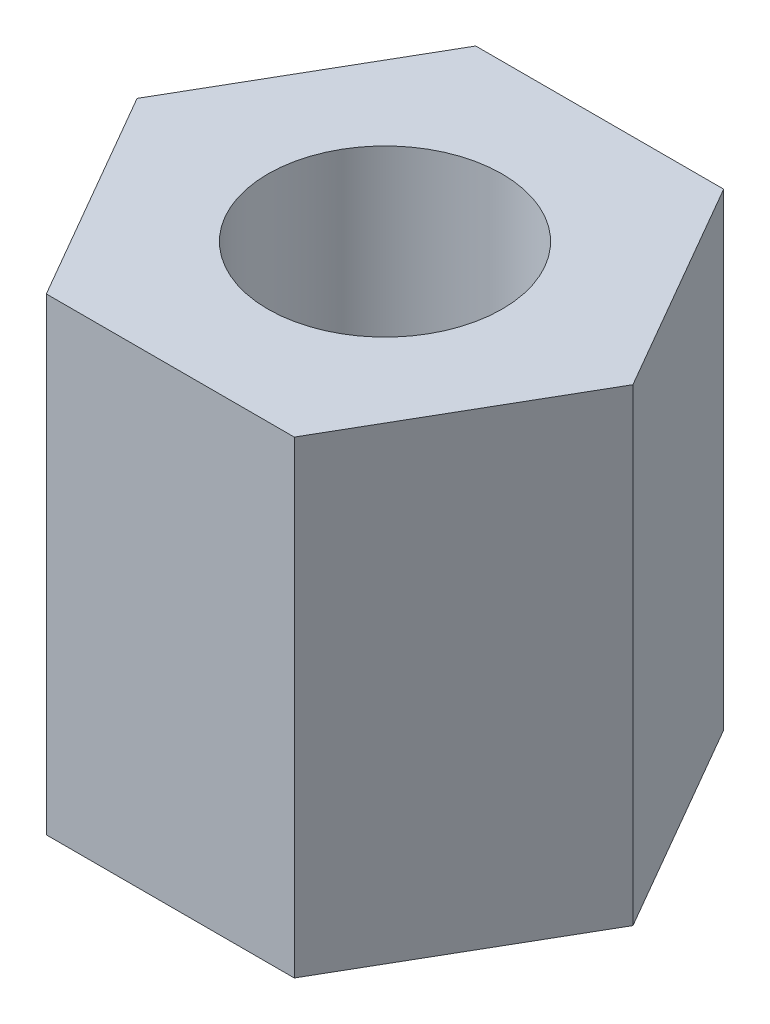
ISO-10303-21;
HEADER;
FILE_DESCRIPTION(('STEP AP214'),'2;1');
FILE_NAME('part.step','',(''),(''),'','','');
FILE_SCHEMA(('AUTOMOTIVE_DESIGN { 1 0 10303 214 1 1 1 1 }'));
ENDSEC;
DATA;
#1=APPLICATION_CONTEXT('core data for automotive mechanical design processes');
#2=APPLICATION_PROTOCOL_DEFINITION('international standard','automotive_design',2000,#1);
#3=PRODUCT_CONTEXT('',#1,'mechanical');
#4=PRODUCT('Part','Part','',(#3));
#5=PRODUCT_RELATED_PRODUCT_CATEGORY('part','',(#4));
#6=PRODUCT_DEFINITION_FORMATION('','',#4);
#7=PRODUCT_DEFINITION_CONTEXT('part definition',#1,'design');
#8=PRODUCT_DEFINITION('design','',#6,#7);
#9=PRODUCT_DEFINITION_SHAPE('','',#8);
#10=(LENGTH_UNIT() NAMED_UNIT(*) SI_UNIT(.MILLI.,.METRE.));
#11=(NAMED_UNIT(*) PLANE_ANGLE_UNIT() SI_UNIT($,.RADIAN.));
#12=(NAMED_UNIT(*) SI_UNIT($,.STERADIAN.) SOLID_ANGLE_UNIT());
#13=UNCERTAINTY_MEASURE_WITH_UNIT(LENGTH_MEASURE(1.E-05),#10,'distance_accuracy_value','');
#14=(GEOMETRIC_REPRESENTATION_CONTEXT(3) GLOBAL_UNCERTAINTY_ASSIGNED_CONTEXT((#13)) GLOBAL_UNIT_ASSIGNED_CONTEXT((#10,
#11,#12)) REPRESENTATION_CONTEXT('',''));
#15=CARTESIAN_POINT('',(0.,0.,0.));
#16=DIRECTION('',(0.,0.,1.));
#17=DIRECTION('',(1.,0.,0.));
#18=AXIS2_PLACEMENT_3D('',#15,#16,#17);
#19=CARTESIAN_POINT('',(0.,6.,0.));
#20=DIRECTION('',(0.,1.,0.));
#21=DIRECTION('',(0.,0.,1.));
#22=AXIS2_PLACEMENT_3D('',#19,#20,#21);
#23=PLANE('',#22);
#24=DIRECTION('',(0.499999999999995,0.,-0.866025403784441));
#25=VECTOR('',#24,1.);
#26=CARTESIAN_POINT('',(1.5877132402715,6.,2.74999999999998));
#27=LINE('',#26,#25);
#28=CARTESIAN_POINT('',(1.5877132402715,6.,2.74999999999998));
#29=VERTEX_POINT('',#28);
#30=CARTESIAN_POINT('',(3.17542648054294,6.,0.));
#31=VERTEX_POINT('',#30);
#32=EDGE_CURVE('E132',#29,#31,#27,.T.);
#33=ORIENTED_EDGE('',*,*,#32,.T.);
#34=DIRECTION('',(-0.500000000000001,0.,-0.866025403784438));
#35=VECTOR('',#34,1.);
#36=CARTESIAN_POINT('',(3.17542648054294,6.,0.));
#37=LINE('',#36,#35);
#38=CARTESIAN_POINT('',(1.58771324027147,6.,-2.75000000000001));
#39=VERTEX_POINT('',#38);
#40=EDGE_CURVE('E90',#31,#39,#37,.T.);
#41=ORIENTED_EDGE('',*,*,#40,.T.);
#42=DIRECTION('',(-1.,0.,0.));
#43=VECTOR('',#42,1.);
#44=CARTESIAN_POINT('',(1.58771324027147,6.,-2.75000000000001));
#45=LINE('',#44,#43);
#46=CARTESIAN_POINT('',(-1.58771324027148,6.,-2.74999999999999));
#47=VERTEX_POINT('',#46);
#48=EDGE_CURVE('E103',#39,#47,#45,.T.);
#49=ORIENTED_EDGE('',*,*,#48,.T.);
#50=DIRECTION('',(-0.499999999999995,0.,0.866025403784442));
#51=VECTOR('',#50,1.);
#52=CARTESIAN_POINT('',(-1.58771324027148,6.,-2.74999999999999));
#53=LINE('',#52,#51);
#54=CARTESIAN_POINT('',(-3.17542648054294,6.,0.));
#55=VERTEX_POINT('',#54);
#56=EDGE_CURVE('E97',#47,#55,#53,.T.);
#57=ORIENTED_EDGE('',*,*,#56,.T.);
#58=DIRECTION('',(0.500000000000007,0.,0.866025403784435));
#59=VECTOR('',#58,1.);
#60=CARTESIAN_POINT('',(-3.17542648054294,6.,0.));
#61=LINE('',#60,#59);
#62=CARTESIAN_POINT('',(-1.58771324027145,6.,2.75000000000002));
#63=VERTEX_POINT('',#62);
#64=EDGE_CURVE('E101',#55,#63,#61,.T.);
#65=ORIENTED_EDGE('',*,*,#64,.T.);
#66=DIRECTION('',(1.,0.,0.));
#67=VECTOR('',#66,1.);
#68=CARTESIAN_POINT('',(-1.58771324027145,6.,2.75000000000002));
#69=LINE('',#68,#67);
#70=EDGE_CURVE('E53',#63,#29,#69,.T.);
#71=ORIENTED_EDGE('',*,*,#70,.T.);
#72=EDGE_LOOP('',(#33,#41,#49,#57,#65,#71));
#73=FACE_BOUND('',#72,.T.);
#74=CARTESIAN_POINT('',(0.,6.,0.));
#75=DIRECTION('',(0.,1.,0.));
#76=DIRECTION('',(0.,0.,1.));
#77=AXIS2_PLACEMENT_3D('',#74,#75,#76);
#78=CIRCLE('',#77,1.5);
#79=CARTESIAN_POINT('',(0.,6.,1.5));
#80=VERTEX_POINT('',#79);
#81=EDGE_CURVE('E125',#80,#80,#78,.T.);
#82=ORIENTED_EDGE('',*,*,#81,.F.);
#83=EDGE_LOOP('',(#82));
#84=FACE_BOUND('',#83,.T.);
#85=ADVANCED_FACE('F36',(#73,#84),#23,.T.);
#86=CARTESIAN_POINT('',(0.,0.,0.));
#87=DIRECTION('',(0.,1.,0.));
#88=DIRECTION('',(0.,0.,1.));
#89=AXIS2_PLACEMENT_3D('',#86,#87,#88);
#90=PLANE('',#89);
#91=DIRECTION('',(0.499999999999995,0.,-0.866025403784441));
#92=VECTOR('',#91,1.);
#93=CARTESIAN_POINT('',(1.5877132402715,0.,2.74999999999998));
#94=LINE('',#93,#92);
#95=CARTESIAN_POINT('',(1.5877132402715,0.,2.74999999999998));
#96=VERTEX_POINT('',#95);
#97=CARTESIAN_POINT('',(3.17542648054294,0.,0.));
#98=VERTEX_POINT('',#97);
#99=EDGE_CURVE('E121',#96,#98,#94,.T.);
#100=ORIENTED_EDGE('',*,*,#99,.F.);
#101=DIRECTION('',(1.,0.,0.));
#102=VECTOR('',#101,1.);
#103=CARTESIAN_POINT('',(-1.58771324027145,0.,2.75000000000002));
#104=LINE('',#103,#102);
#105=CARTESIAN_POINT('',(-1.58771324027145,0.,2.75000000000002));
#106=VERTEX_POINT('',#105);
#107=EDGE_CURVE('E82',#106,#96,#104,.T.);
#108=ORIENTED_EDGE('',*,*,#107,.F.);
#109=DIRECTION('',(0.500000000000007,0.,0.866025403784435));
#110=VECTOR('',#109,1.);
#111=CARTESIAN_POINT('',(-3.17542648054294,0.,0.));
#112=LINE('',#111,#110);
#113=CARTESIAN_POINT('',(-3.17542648054294,0.,0.));
#114=VERTEX_POINT('',#113);
#115=EDGE_CURVE('E76',#114,#106,#112,.T.);
#116=ORIENTED_EDGE('',*,*,#115,.F.);
#117=DIRECTION('',(-0.499999999999995,0.,0.866025403784442));
#118=VECTOR('',#117,1.);
#119=CARTESIAN_POINT('',(-1.58771324027148,0.,-2.74999999999999));
#120=LINE('',#119,#118);
#121=CARTESIAN_POINT('',(-1.58771324027148,0.,-2.74999999999999));
#122=VERTEX_POINT('',#121);
#123=EDGE_CURVE('E111',#122,#114,#120,.T.);
#124=ORIENTED_EDGE('',*,*,#123,.F.);
#125=DIRECTION('',(-1.,0.,0.));
#126=VECTOR('',#125,1.);
#127=CARTESIAN_POINT('',(1.58771324027147,0.,-2.75000000000001));
#128=LINE('',#127,#126);
#129=CARTESIAN_POINT('',(1.58771324027147,0.,-2.75000000000001));
#130=VERTEX_POINT('',#129);
#131=EDGE_CURVE('E127',#130,#122,#128,.T.);
#132=ORIENTED_EDGE('',*,*,#131,.F.);
#133=DIRECTION('',(-0.500000000000001,0.,-0.866025403784438));
#134=VECTOR('',#133,1.);
#135=CARTESIAN_POINT('',(3.17542648054294,0.,0.));
#136=LINE('',#135,#134);
#137=EDGE_CURVE('E124',#98,#130,#136,.T.);
#138=ORIENTED_EDGE('',*,*,#137,.F.);
#139=EDGE_LOOP('',(#100,#108,#116,#124,#132,#138));
#140=FACE_BOUND('',#139,.T.);
#141=CARTESIAN_POINT('',(0.,0.,0.));
#142=DIRECTION('',(0.,1.,0.));
#143=DIRECTION('',(0.,0.,1.));
#144=AXIS2_PLACEMENT_3D('',#141,#142,#143);
#145=CIRCLE('',#144,1.5);
#146=CARTESIAN_POINT('',(0.,0.,1.5));
#147=VERTEX_POINT('',#146);
#148=EDGE_CURVE('E234',#147,#147,#145,.T.);
#149=ORIENTED_EDGE('',*,*,#148,.T.);
#150=EDGE_LOOP('',(#149));
#151=FACE_BOUND('',#150,.T.);
#152=ADVANCED_FACE('F141',(#140,#151),#90,.F.);
#153=CARTESIAN_POINT('',(1.5877132402715,6.,2.74999999999998));
#154=DIRECTION('',(-0.866025403784442,0.,-0.499999999999995));
#155=DIRECTION('',(-0.499999999999995,0.,0.866025403784442));
#156=AXIS2_PLACEMENT_3D('',#153,#154,#155);
#157=PLANE('',#156);
#158=ORIENTED_EDGE('',*,*,#99,.T.);
#159=DIRECTION('',(0.,-1.,0.));
#160=VECTOR('',#159,1.);
#161=CARTESIAN_POINT('',(3.17542648054294,6.,0.));
#162=LINE('',#161,#160);
#163=EDGE_CURVE('E11',#31,#98,#162,.T.);
#164=ORIENTED_EDGE('',*,*,#163,.F.);
#165=ORIENTED_EDGE('',*,*,#32,.F.);
#166=DIRECTION('',(0.,-1.,0.));
#167=VECTOR('',#166,1.);
#168=CARTESIAN_POINT('',(1.5877132402715,6.,2.74999999999998));
#169=LINE('',#168,#167);
#170=EDGE_CURVE('E117',#29,#96,#169,.T.);
#171=ORIENTED_EDGE('',*,*,#170,.T.);
#172=EDGE_LOOP('',(#158,#164,#165,#171));
#173=FACE_BOUND('',#172,.T.);
#174=ADVANCED_FACE('F38',(#173),#157,.F.);
#175=CARTESIAN_POINT('',(3.17542648054294,6.,0.));
#176=DIRECTION('',(-0.866025403784438,0.,0.500000000000001));
#177=DIRECTION('',(0.500000000000001,0.,0.866025403784438));
#178=AXIS2_PLACEMENT_3D('',#175,#176,#177);
#179=PLANE('',#178);
#180=ORIENTED_EDGE('',*,*,#137,.T.);
#181=DIRECTION('',(0.,-1.,0.));
#182=VECTOR('',#181,1.);
#183=CARTESIAN_POINT('',(1.58771324027147,6.,-2.75000000000001));
#184=LINE('',#183,#182);
#185=EDGE_CURVE('E45',#39,#130,#184,.T.);
#186=ORIENTED_EDGE('',*,*,#185,.F.);
#187=ORIENTED_EDGE('',*,*,#40,.F.);
#188=ORIENTED_EDGE('',*,*,#163,.T.);
#189=EDGE_LOOP('',(#180,#186,#187,#188));
#190=FACE_BOUND('',#189,.T.);
#191=ADVANCED_FACE('F166',(#190),#179,.F.);
#192=CARTESIAN_POINT('',(1.58771324027147,6.,-2.75000000000001));
#193=DIRECTION('',(0.,0.,1.));
#194=DIRECTION('',(1.,0.,0.));
#195=AXIS2_PLACEMENT_3D('',#192,#193,#194);
#196=PLANE('',#195);
#197=ORIENTED_EDGE('',*,*,#131,.T.);
#198=DIRECTION('',(0.,-1.,0.));
#199=VECTOR('',#198,1.);
#200=CARTESIAN_POINT('',(-1.58771324027148,6.,-2.74999999999999));
#201=LINE('',#200,#199);
#202=EDGE_CURVE('E112',#47,#122,#201,.T.);
#203=ORIENTED_EDGE('',*,*,#202,.F.);
#204=ORIENTED_EDGE('',*,*,#48,.F.);
#205=ORIENTED_EDGE('',*,*,#185,.T.);
#206=EDGE_LOOP('',(#197,#203,#204,#205));
#207=FACE_BOUND('',#206,.T.);
#208=ADVANCED_FACE('F138',(#207),#196,.F.);
#209=CARTESIAN_POINT('',(-1.58771324027148,6.,-2.74999999999999));
#210=DIRECTION('',(0.866025403784441,0.,0.499999999999995));
#211=DIRECTION('',(0.499999999999995,0.,-0.866025403784442));
#212=AXIS2_PLACEMENT_3D('',#209,#210,#211);
#213=PLANE('',#212);
#214=ORIENTED_EDGE('',*,*,#123,.T.);
#215=DIRECTION('',(0.,-1.,0.));
#216=VECTOR('',#215,1.);
#217=CARTESIAN_POINT('',(-3.17542648054294,6.,0.));
#218=LINE('',#217,#216);
#219=EDGE_CURVE('E108',#55,#114,#218,.T.);
#220=ORIENTED_EDGE('',*,*,#219,.F.);
#221=ORIENTED_EDGE('',*,*,#56,.F.);
#222=ORIENTED_EDGE('',*,*,#202,.T.);
#223=EDGE_LOOP('',(#214,#220,#221,#222));
#224=FACE_BOUND('',#223,.T.);
#225=ADVANCED_FACE('F109',(#224),#213,.F.);
#226=CARTESIAN_POINT('',(-3.17542648054294,6.,0.));
#227=DIRECTION('',(0.866025403784434,0.,-0.500000000000007));
#228=DIRECTION('',(-0.500000000000007,0.,-0.866025403784435));
#229=AXIS2_PLACEMENT_3D('',#226,#227,#228);
#230=PLANE('',#229);
#231=ORIENTED_EDGE('',*,*,#115,.T.);
#232=DIRECTION('',(0.,-1.,0.));
#233=VECTOR('',#232,1.);
#234=CARTESIAN_POINT('',(-1.58771324027145,6.,2.75000000000002));
#235=LINE('',#234,#233);
#236=EDGE_CURVE('E113',#63,#106,#235,.T.);
#237=ORIENTED_EDGE('',*,*,#236,.F.);
#238=ORIENTED_EDGE('',*,*,#64,.F.);
#239=ORIENTED_EDGE('',*,*,#219,.T.);
#240=EDGE_LOOP('',(#231,#237,#238,#239));
#241=FACE_BOUND('',#240,.T.);
#242=ADVANCED_FACE('F115',(#241),#230,.F.);
#243=CARTESIAN_POINT('',(-1.58771324027145,6.,2.75000000000002));
#244=DIRECTION('',(0.,0.,-1.));
#245=DIRECTION('',(-1.,0.,0.));
#246=AXIS2_PLACEMENT_3D('',#243,#244,#245);
#247=PLANE('',#246);
#248=ORIENTED_EDGE('',*,*,#107,.T.);
#249=ORIENTED_EDGE('',*,*,#170,.F.);
#250=ORIENTED_EDGE('',*,*,#70,.F.);
#251=ORIENTED_EDGE('',*,*,#236,.T.);
#252=EDGE_LOOP('',(#248,#249,#250,#251));
#253=FACE_BOUND('',#252,.T.);
#254=ADVANCED_FACE('F146',(#253),#247,.F.);
#255=CARTESIAN_POINT('',(0.,6.,0.));
#256=DIRECTION('',(0.,-1.,0.));
#257=DIRECTION('',(0.,0.,-1.));
#258=AXIS2_PLACEMENT_3D('',#255,#256,#257);
#259=CYLINDRICAL_SURFACE('',#258,1.5);
#260=ORIENTED_EDGE('',*,*,#81,.T.);
#261=EDGE_LOOP('',(#260));
#262=FACE_BOUND('',#261,.T.);
#263=ORIENTED_EDGE('',*,*,#148,.F.);
#264=EDGE_LOOP('',(#263));
#265=FACE_BOUND('',#264,.T.);
#266=ADVANCED_FACE('F148',(#262,#265),#259,.F.);
#267=CLOSED_SHELL('',(#85,#152,#174,#191,#208,#225,#242,#254,#266));
#268=MANIFOLD_SOLID_BREP('B2',#267);
#269=ADVANCED_BREP_SHAPE_REPRESENTATION('',(#18,#268),#14);
#270=SHAPE_DEFINITION_REPRESENTATION(#9,#269);
ENDSEC;
END-ISO-10303-21;
